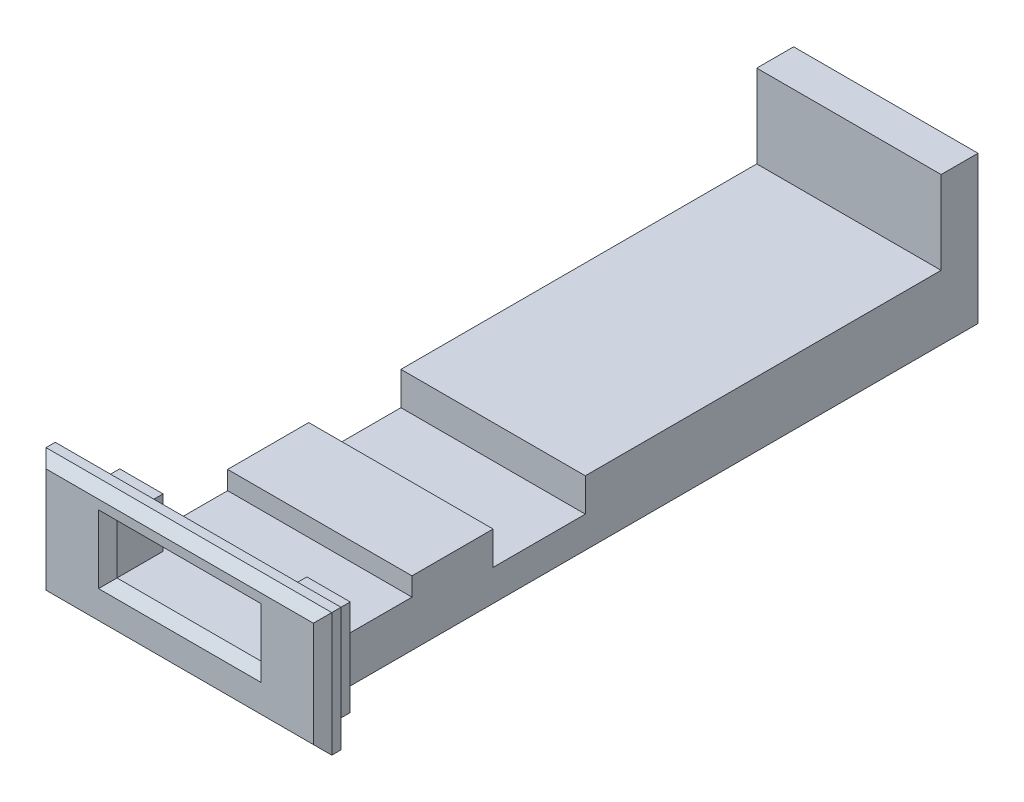
ISO-10303-21;
HEADER;
FILE_DESCRIPTION(('STEP AP214'),'2;1');
FILE_NAME('part.step','',(''),(''),'','','');
FILE_SCHEMA(('AUTOMOTIVE_DESIGN { 1 0 10303 214 1 1 1 1 }'));
ENDSEC;
DATA;
#1=APPLICATION_CONTEXT('core data for automotive mechanical design processes');
#2=APPLICATION_PROTOCOL_DEFINITION('international standard','automotive_design',2000,#1);
#3=PRODUCT_CONTEXT('',#1,'mechanical');
#4=PRODUCT('Part','Part','',(#3));
#5=PRODUCT_RELATED_PRODUCT_CATEGORY('part','',(#4));
#6=PRODUCT_DEFINITION_FORMATION('','',#4);
#7=PRODUCT_DEFINITION_CONTEXT('part definition',#1,'design');
#8=PRODUCT_DEFINITION('design','',#6,#7);
#9=PRODUCT_DEFINITION_SHAPE('','',#8);
#10=(LENGTH_UNIT() NAMED_UNIT(*) SI_UNIT(.MILLI.,.METRE.));
#11=(NAMED_UNIT(*) PLANE_ANGLE_UNIT() SI_UNIT($,.RADIAN.));
#12=(NAMED_UNIT(*) SI_UNIT($,.STERADIAN.) SOLID_ANGLE_UNIT());
#13=UNCERTAINTY_MEASURE_WITH_UNIT(LENGTH_MEASURE(1.E-05),#10,'distance_accuracy_value','');
#14=(GEOMETRIC_REPRESENTATION_CONTEXT(3) GLOBAL_UNCERTAINTY_ASSIGNED_CONTEXT((#13)) GLOBAL_UNIT_ASSIGNED_CONTEXT((#10,
#11,#12)) REPRESENTATION_CONTEXT('',''));
#15=CARTESIAN_POINT('',(0.,0.,0.));
#16=DIRECTION('',(0.,0.,1.));
#17=DIRECTION('',(1.,0.,0.));
#18=AXIS2_PLACEMENT_3D('',#15,#16,#17);
#19=CARTESIAN_POINT('',(5.,3.5,-33.3));
#20=DIRECTION('',(0.,-1.,0.));
#21=DIRECTION('',(0.,0.,-1.));
#22=AXIS2_PLACEMENT_3D('',#19,#20,#21);
#23=PLANE('',#22);
#24=DIRECTION('',(0.,0.,1.));
#25=VECTOR('',#24,1.);
#26=CARTESIAN_POINT('',(5.,3.5,-33.3));
#27=LINE('',#26,#25);
#28=CARTESIAN_POINT('',(5.,3.5,-9.));
#29=VERTEX_POINT('',#28);
#30=CARTESIAN_POINT('',(5.,3.5,-4.6));
#31=VERTEX_POINT('',#30);
#32=EDGE_CURVE('E345',#29,#31,#27,.T.);
#33=ORIENTED_EDGE('',*,*,#32,.F.);
#34=DIRECTION('',(-1.,0.,0.));
#35=VECTOR('',#34,1.);
#36=CARTESIAN_POINT('',(5.,3.5,-9.));
#37=LINE('',#36,#35);
#38=CARTESIAN_POINT('',(-5.,3.5,-9.));
#39=VERTEX_POINT('',#38);
#40=EDGE_CURVE('E423',#29,#39,#37,.T.);
#41=ORIENTED_EDGE('',*,*,#40,.T.);
#42=DIRECTION('',(0.,0.,1.));
#43=VECTOR('',#42,1.);
#44=CARTESIAN_POINT('',(-5.,3.5,-33.3));
#45=LINE('',#44,#43);
#46=CARTESIAN_POINT('',(-5.,3.5,-4.6));
#47=VERTEX_POINT('',#46);
#48=EDGE_CURVE('E357',#39,#47,#45,.T.);
#49=ORIENTED_EDGE('',*,*,#48,.T.);
#50=DIRECTION('',(1.,0.,0.));
#51=VECTOR('',#50,1.);
#52=CARTESIAN_POINT('',(5.,3.5,-4.6));
#53=LINE('',#52,#51);
#54=EDGE_CURVE('E346',#47,#31,#53,.T.);
#55=ORIENTED_EDGE('',*,*,#54,.T.);
#56=EDGE_LOOP('',(#33,#41,#49,#55));
#57=FACE_BOUND('',#56,.T.);
#58=ADVANCED_FACE('F35',(#57),#23,.F.);
#59=CARTESIAN_POINT('',(0.,0.,0.));
#60=DIRECTION('',(0.,0.,-1.));
#61=DIRECTION('',(-1.,0.,0.));
#62=AXIS2_PLACEMENT_3D('',#59,#60,#61);
#63=PLANE('',#62);
#64=DIRECTION('',(0.,-1.,0.));
#65=VECTOR('',#64,1.);
#66=CARTESIAN_POINT('',(5.,0.,0.));
#67=LINE('',#66,#65);
#68=CARTESIAN_POINT('',(5.,2.5,0.));
#69=VERTEX_POINT('',#68);
#70=CARTESIAN_POINT('',(5.,0.,0.));
#71=VERTEX_POINT('',#70);
#72=EDGE_CURVE('E361',#69,#71,#67,.T.);
#73=ORIENTED_EDGE('',*,*,#72,.F.);
#74=DIRECTION('',(1.,0.,0.));
#75=VECTOR('',#74,1.);
#76=CARTESIAN_POINT('',(5.,2.5,0.));
#77=LINE('',#76,#75);
#78=CARTESIAN_POINT('',(3.9,2.5,0.));
#79=VERTEX_POINT('',#78);
#80=EDGE_CURVE('E374',#79,#69,#77,.T.);
#81=ORIENTED_EDGE('',*,*,#80,.F.);
#82=DIRECTION('',(0.,1.,0.));
#83=VECTOR('',#82,1.);
#84=CARTESIAN_POINT('',(3.9,2.5,0.));
#85=LINE('',#84,#83);
#86=CARTESIAN_POINT('',(3.9,5.2,0.));
#87=VERTEX_POINT('',#86);
#88=EDGE_CURVE('E390',#79,#87,#85,.T.);
#89=ORIENTED_EDGE('',*,*,#88,.T.);
#90=DIRECTION('',(-1.,0.,0.));
#91=VECTOR('',#90,1.);
#92=CARTESIAN_POINT('',(-6.25,5.2,0.));
#93=LINE('',#92,#91);
#94=CARTESIAN_POINT('',(6.25,5.2,0.));
#95=VERTEX_POINT('',#94);
#96=EDGE_CURVE('E251',#95,#87,#93,.T.);
#97=ORIENTED_EDGE('',*,*,#96,.F.);
#98=DIRECTION('',(0.,1.,0.));
#99=VECTOR('',#98,1.);
#100=CARTESIAN_POINT('',(6.25,0.,0.));
#101=LINE('',#100,#99);
#102=CARTESIAN_POINT('',(6.25,0.,0.));
#103=VERTEX_POINT('',#102);
#104=EDGE_CURVE('E406',#103,#95,#101,.T.);
#105=ORIENTED_EDGE('',*,*,#104,.F.);
#106=DIRECTION('',(1.,0.,0.));
#107=VECTOR('',#106,1.);
#108=CARTESIAN_POINT('',(-6.25,0.,0.));
#109=LINE('',#108,#107);
#110=EDGE_CURVE('E402',#71,#103,#109,.T.);
#111=ORIENTED_EDGE('',*,*,#110,.F.);
#112=EDGE_LOOP('',(#73,#81,#89,#97,#105,#111));
#113=FACE_BOUND('',#112,.T.);
#114=ADVANCED_FACE('F513',(#113),#63,.T.);
#115=CARTESIAN_POINT('',(-6.25,5.2,2.));
#116=DIRECTION('',(0.,-1.,0.));
#117=DIRECTION('',(0.,0.,-1.));
#118=AXIS2_PLACEMENT_3D('',#115,#116,#117);
#119=PLANE('',#118);
#120=DIRECTION('',(-1.,0.,0.));
#121=VECTOR('',#120,1.);
#122=CARTESIAN_POINT('',(-6.25,5.2,2.));
#123=LINE('',#122,#121);
#124=CARTESIAN_POINT('',(-3.9,5.2,2.));
#125=VERTEX_POINT('',#124);
#126=CARTESIAN_POINT('',(-6.25,5.2,2.));
#127=VERTEX_POINT('',#126);
#128=EDGE_CURVE('E264',#125,#127,#123,.T.);
#129=ORIENTED_EDGE('',*,*,#128,.F.);
#130=DIRECTION('',(0.,0.,1.));
#131=VECTOR('',#130,1.);
#132=CARTESIAN_POINT('',(-3.9,5.2,0.));
#133=LINE('',#132,#131);
#134=CARTESIAN_POINT('',(-3.9,5.2,0.));
#135=VERTEX_POINT('',#134);
#136=EDGE_CURVE('E253',#135,#125,#133,.T.);
#137=ORIENTED_EDGE('',*,*,#136,.F.);
#138=CARTESIAN_POINT('',(-6.25,5.2,0.));
#139=VERTEX_POINT('',#138);
#140=EDGE_CURVE('E408',#135,#139,#93,.T.);
#141=ORIENTED_EDGE('',*,*,#140,.T.);
#142=DIRECTION('',(0.,0.,-1.));
#143=VECTOR('',#142,1.);
#144=CARTESIAN_POINT('',(-6.25,5.2,2.));
#145=LINE('',#144,#143);
#146=EDGE_CURVE('E263',#127,#139,#145,.T.);
#147=ORIENTED_EDGE('',*,*,#146,.F.);
#148=EDGE_LOOP('',(#129,#137,#141,#147));
#149=FACE_BOUND('',#148,.T.);
#150=ADVANCED_FACE('F520',(#149),#119,.F.);
#151=CARTESIAN_POINT('',(-6.25,0.,2.));
#152=DIRECTION('',(1.,0.,0.));
#153=DIRECTION('',(0.,0.,-1.));
#154=AXIS2_PLACEMENT_3D('',#151,#152,#153);
#155=PLANE('',#154);
#156=DIRECTION('',(0.,-1.,0.));
#157=VECTOR('',#156,1.);
#158=CARTESIAN_POINT('',(-6.25,0.,0.));
#159=LINE('',#158,#157);
#160=CARTESIAN_POINT('',(-6.25,0.,0.));
#161=VERTEX_POINT('',#160);
#162=EDGE_CURVE('E394',#139,#161,#159,.T.);
#163=ORIENTED_EDGE('',*,*,#162,.T.);
#164=DIRECTION('',(0.,0.,-1.));
#165=VECTOR('',#164,1.);
#166=CARTESIAN_POINT('',(-6.25,0.,2.));
#167=LINE('',#166,#165);
#168=CARTESIAN_POINT('',(-6.25,0.,2.));
#169=VERTEX_POINT('',#168);
#170=EDGE_CURVE('E417',#169,#161,#167,.T.);
#171=ORIENTED_EDGE('',*,*,#170,.F.);
#172=DIRECTION('',(0.,-1.,0.));
#173=VECTOR('',#172,1.);
#174=CARTESIAN_POINT('',(-6.25,0.,2.));
#175=LINE('',#174,#173);
#176=EDGE_CURVE('E396',#127,#169,#175,.T.);
#177=ORIENTED_EDGE('',*,*,#176,.F.);
#178=ORIENTED_EDGE('',*,*,#146,.T.);
#179=EDGE_LOOP('',(#163,#171,#177,#178));
#180=FACE_BOUND('',#179,.T.);
#181=ADVANCED_FACE('F620',(#180),#155,.F.);
#182=CARTESIAN_POINT('',(-6.25,0.,2.));
#183=DIRECTION('',(0.,1.,0.));
#184=DIRECTION('',(0.,0.,1.));
#185=AXIS2_PLACEMENT_3D('',#182,#183,#184);
#186=PLANE('',#185);
#187=DIRECTION('',(0.,0.,-1.));
#188=VECTOR('',#187,1.);
#189=CARTESIAN_POINT('',(7.75,0.,3.));
#190=LINE('',#189,#188);
#191=CARTESIAN_POINT('',(7.75,0.,2.5));
#192=VERTEX_POINT('',#191);
#193=CARTESIAN_POINT('',(7.75,0.,2.));
#194=VERTEX_POINT('',#193);
#195=EDGE_CURVE('E292',#192,#194,#190,.T.);
#196=ORIENTED_EDGE('',*,*,#195,.F.);
#197=DIRECTION('',(-1.,0.,0.));
#198=VECTOR('',#197,1.);
#199=CARTESIAN_POINT('',(-6.25,0.,2.5));
#200=LINE('',#199,#198);
#201=CARTESIAN_POINT('',(-7.75,0.,2.5));
#202=VERTEX_POINT('',#201);
#203=EDGE_CURVE('E45',#192,#202,#200,.T.);
#204=ORIENTED_EDGE('',*,*,#203,.T.);
#205=DIRECTION('',(0.,0.,-1.));
#206=VECTOR('',#205,1.);
#207=CARTESIAN_POINT('',(-7.75,0.,3.));
#208=LINE('',#207,#206);
#209=CARTESIAN_POINT('',(-7.75,0.,2.));
#210=VERTEX_POINT('',#209);
#211=EDGE_CURVE('E294',#202,#210,#208,.T.);
#212=ORIENTED_EDGE('',*,*,#211,.T.);
#213=DIRECTION('',(1.,0.,0.));
#214=VECTOR('',#213,1.);
#215=CARTESIAN_POINT('',(-7.75,0.,2.));
#216=LINE('',#215,#214);
#217=EDGE_CURVE('E279',#210,#169,#216,.T.);
#218=ORIENTED_EDGE('',*,*,#217,.T.);
#219=ORIENTED_EDGE('',*,*,#170,.T.);
#220=CARTESIAN_POINT('',(-5.,0.,0.));
#221=VERTEX_POINT('',#220);
#222=EDGE_CURVE('E403',#161,#221,#109,.T.);
#223=ORIENTED_EDGE('',*,*,#222,.T.);
#224=DIRECTION('',(0.,0.,1.));
#225=VECTOR('',#224,1.);
#226=CARTESIAN_POINT('',(-5.,0.,-4.6));
#227=LINE('',#226,#225);
#228=CARTESIAN_POINT('',(-5.,0.,-35.3));
#229=VERTEX_POINT('',#228);
#230=EDGE_CURVE('E380',#229,#221,#227,.T.);
#231=ORIENTED_EDGE('',*,*,#230,.F.);
#232=DIRECTION('',(-1.,0.,0.));
#233=VECTOR('',#232,1.);
#234=CARTESIAN_POINT('',(-5.,0.,-35.3));
#235=LINE('',#234,#233);
#236=CARTESIAN_POINT('',(5.,0.,-35.3));
#237=VERTEX_POINT('',#236);
#238=EDGE_CURVE('E327',#237,#229,#235,.T.);
#239=ORIENTED_EDGE('',*,*,#238,.F.);
#240=DIRECTION('',(0.,0.,1.));
#241=VECTOR('',#240,1.);
#242=CARTESIAN_POINT('',(5.,0.,-4.6));
#243=LINE('',#242,#241);
#244=EDGE_CURVE('E383',#237,#71,#243,.T.);
#245=ORIENTED_EDGE('',*,*,#244,.T.);
#246=ORIENTED_EDGE('',*,*,#110,.T.);
#247=DIRECTION('',(0.,0.,-1.));
#248=VECTOR('',#247,1.);
#249=CARTESIAN_POINT('',(6.25,0.,2.));
#250=LINE('',#249,#248);
#251=CARTESIAN_POINT('',(6.25,0.,2.));
#252=VERTEX_POINT('',#251);
#253=EDGE_CURVE('E414',#252,#103,#250,.T.);
#254=ORIENTED_EDGE('',*,*,#253,.F.);
#255=EDGE_CURVE('E278',#252,#194,#216,.T.);
#256=ORIENTED_EDGE('',*,*,#255,.T.);
#257=EDGE_LOOP('',(#196,#204,#212,#218,#219,#223,#231,#239,#245,#246,#254,#256));
#258=FACE_BOUND('',#257,.T.);
#259=ADVANCED_FACE('F559',(#258),#186,.F.);
#260=CARTESIAN_POINT('',(6.25,0.,2.));
#261=DIRECTION('',(-1.,0.,0.));
#262=DIRECTION('',(0.,0.,1.));
#263=AXIS2_PLACEMENT_3D('',#260,#261,#262);
#264=PLANE('',#263);
#265=ORIENTED_EDGE('',*,*,#104,.T.);
#266=DIRECTION('',(0.,0.,-1.));
#267=VECTOR('',#266,1.);
#268=CARTESIAN_POINT('',(6.25,5.2,2.));
#269=LINE('',#268,#267);
#270=CARTESIAN_POINT('',(6.25,5.2,2.));
#271=VERTEX_POINT('',#270);
#272=EDGE_CURVE('E412',#271,#95,#269,.T.);
#273=ORIENTED_EDGE('',*,*,#272,.F.);
#274=DIRECTION('',(0.,1.,0.));
#275=VECTOR('',#274,1.);
#276=CARTESIAN_POINT('',(6.25,0.,2.));
#277=LINE('',#276,#275);
#278=EDGE_CURVE('E262',#252,#271,#277,.T.);
#279=ORIENTED_EDGE('',*,*,#278,.F.);
#280=ORIENTED_EDGE('',*,*,#253,.T.);
#281=EDGE_LOOP('',(#265,#273,#279,#280));
#282=FACE_BOUND('',#281,.T.);
#283=ADVANCED_FACE('F633',(#282),#264,.F.);
#284=ORIENTED_EDGE('',*,*,#96,.T.);
#285=DIRECTION('',(0.,0.,-1.));
#286=VECTOR('',#285,1.);
#287=CARTESIAN_POINT('',(3.9,5.2,0.));
#288=LINE('',#287,#286);
#289=CARTESIAN_POINT('',(3.9,5.2,2.));
#290=VERTEX_POINT('',#289);
#291=EDGE_CURVE('E232',#290,#87,#288,.T.);
#292=ORIENTED_EDGE('',*,*,#291,.F.);
#293=EDGE_CURVE('E248',#271,#290,#123,.T.);
#294=ORIENTED_EDGE('',*,*,#293,.F.);
#295=ORIENTED_EDGE('',*,*,#272,.T.);
#296=EDGE_LOOP('',(#284,#292,#294,#295));
#297=FACE_BOUND('',#296,.T.);
#298=ADVANCED_FACE('F246',(#297),#119,.F.);
#299=CARTESIAN_POINT('',(-5.,2.5,0.));
#300=VERTEX_POINT('',#299);
#301=CARTESIAN_POINT('',(-3.9,2.5,0.));
#302=VERTEX_POINT('',#301);
#303=EDGE_CURVE('E366',#300,#302,#77,.T.);
#304=ORIENTED_EDGE('',*,*,#303,.F.);
#305=DIRECTION('',(0.,1.,0.));
#306=VECTOR('',#305,1.);
#307=CARTESIAN_POINT('',(-5.,0.,0.));
#308=LINE('',#307,#306);
#309=EDGE_CURVE('E369',#221,#300,#308,.T.);
#310=ORIENTED_EDGE('',*,*,#309,.F.);
#311=ORIENTED_EDGE('',*,*,#222,.F.);
#312=ORIENTED_EDGE('',*,*,#162,.F.);
#313=ORIENTED_EDGE('',*,*,#140,.F.);
#314=DIRECTION('',(0.,1.,0.));
#315=VECTOR('',#314,1.);
#316=CARTESIAN_POINT('',(-3.9,2.5,0.));
#317=LINE('',#316,#315);
#318=EDGE_CURVE('E392',#302,#135,#317,.T.);
#319=ORIENTED_EDGE('',*,*,#318,.F.);
#320=EDGE_LOOP('',(#304,#310,#311,#312,#313,#319));
#321=FACE_BOUND('',#320,.T.);
#322=ADVANCED_FACE('F523',(#321),#63,.T.);
#323=CARTESIAN_POINT('',(-3.9,2.5,0.));
#324=DIRECTION('',(-1.,0.,0.));
#325=DIRECTION('',(0.,0.,1.));
#326=AXIS2_PLACEMENT_3D('',#323,#324,#325);
#327=PLANE('',#326);
#328=DIRECTION('',(0.,0.,-1.));
#329=VECTOR('',#328,1.);
#330=CARTESIAN_POINT('',(-3.9,5.2,3.));
#331=LINE('',#330,#329);
#332=CARTESIAN_POINT('',(-3.9,5.2,2.5));
#333=VERTEX_POINT('',#332);
#334=EDGE_CURVE('E240',#333,#125,#331,.T.);
#335=ORIENTED_EDGE('',*,*,#334,.F.);
#336=DIRECTION('',(0.,-1.,0.));
#337=VECTOR('',#336,1.);
#338=CARTESIAN_POINT('',(-3.9,2.5,2.5));
#339=LINE('',#338,#337);
#340=CARTESIAN_POINT('',(-3.9,2.5,2.5));
#341=VERTEX_POINT('',#340);
#342=EDGE_CURVE('E453',#333,#341,#339,.T.);
#343=ORIENTED_EDGE('',*,*,#342,.T.);
#344=DIRECTION('',(0.,0.,1.));
#345=VECTOR('',#344,1.);
#346=CARTESIAN_POINT('',(-3.9,2.5,0.));
#347=LINE('',#346,#345);
#348=EDGE_CURVE('E252',#302,#341,#347,.T.);
#349=ORIENTED_EDGE('',*,*,#348,.F.);
#350=ORIENTED_EDGE('',*,*,#318,.T.);
#351=ORIENTED_EDGE('',*,*,#136,.T.);
#352=EDGE_LOOP('',(#335,#343,#349,#350,#351));
#353=FACE_BOUND('',#352,.T.);
#354=ADVANCED_FACE('F664',(#353),#327,.F.);
#355=CARTESIAN_POINT('',(3.9,2.5,0.));
#356=DIRECTION('',(1.,0.,0.));
#357=DIRECTION('',(0.,0.,-1.));
#358=AXIS2_PLACEMENT_3D('',#355,#356,#357);
#359=PLANE('',#358);
#360=DIRECTION('',(0.,0.,-1.));
#361=VECTOR('',#360,1.);
#362=CARTESIAN_POINT('',(3.9,2.5,0.));
#363=LINE('',#362,#361);
#364=CARTESIAN_POINT('',(3.9,2.5,2.5));
#365=VERTEX_POINT('',#364);
#366=EDGE_CURVE('E388',#365,#79,#363,.T.);
#367=ORIENTED_EDGE('',*,*,#366,.F.);
#368=DIRECTION('',(0.,1.,0.));
#369=VECTOR('',#368,1.);
#370=CARTESIAN_POINT('',(3.9,2.5,2.5));
#371=LINE('',#370,#369);
#372=CARTESIAN_POINT('',(3.9,5.2,2.5));
#373=VERTEX_POINT('',#372);
#374=EDGE_CURVE('E235',#365,#373,#371,.T.);
#375=ORIENTED_EDGE('',*,*,#374,.T.);
#376=DIRECTION('',(0.,0.,-1.));
#377=VECTOR('',#376,1.);
#378=CARTESIAN_POINT('',(3.9,5.2,3.));
#379=LINE('',#378,#377);
#380=EDGE_CURVE('E227',#373,#290,#379,.T.);
#381=ORIENTED_EDGE('',*,*,#380,.T.);
#382=ORIENTED_EDGE('',*,*,#291,.T.);
#383=ORIENTED_EDGE('',*,*,#88,.F.);
#384=EDGE_LOOP('',(#367,#375,#381,#382,#383));
#385=FACE_BOUND('',#384,.T.);
#386=ADVANCED_FACE('F230',(#385),#359,.F.);
#387=CARTESIAN_POINT('',(0.,2.5,0.));
#388=DIRECTION('',(0.,1.,0.));
#389=DIRECTION('',(0.,0.,1.));
#390=AXIS2_PLACEMENT_3D('',#387,#388,#389);
#391=PLANE('',#390);
#392=ORIENTED_EDGE('',*,*,#348,.T.);
#393=DIRECTION('',(1.,0.,0.));
#394=VECTOR('',#393,1.);
#395=CARTESIAN_POINT('',(3.9,2.5,2.5));
#396=LINE('',#395,#394);
#397=EDGE_CURVE('E429',#341,#365,#396,.T.);
#398=ORIENTED_EDGE('',*,*,#397,.T.);
#399=ORIENTED_EDGE('',*,*,#366,.T.);
#400=ORIENTED_EDGE('',*,*,#80,.T.);
#401=DIRECTION('',(0.,0.,1.));
#402=VECTOR('',#401,1.);
#403=CARTESIAN_POINT('',(5.,2.5,-4.6));
#404=LINE('',#403,#402);
#405=CARTESIAN_POINT('',(5.,2.5,-4.6));
#406=VERTEX_POINT('',#405);
#407=EDGE_CURVE('E365',#406,#69,#404,.T.);
#408=ORIENTED_EDGE('',*,*,#407,.F.);
#409=DIRECTION('',(1.,0.,0.));
#410=VECTOR('',#409,1.);
#411=CARTESIAN_POINT('',(5.,2.5,-4.6));
#412=LINE('',#411,#410);
#413=CARTESIAN_POINT('',(-5.,2.5,-4.6));
#414=VERTEX_POINT('',#413);
#415=EDGE_CURVE('E362',#414,#406,#412,.T.);
#416=ORIENTED_EDGE('',*,*,#415,.F.);
#417=DIRECTION('',(0.,0.,1.));
#418=VECTOR('',#417,1.);
#419=CARTESIAN_POINT('',(-5.,2.5,-4.6));
#420=LINE('',#419,#418);
#421=EDGE_CURVE('E377',#414,#300,#420,.T.);
#422=ORIENTED_EDGE('',*,*,#421,.T.);
#423=ORIENTED_EDGE('',*,*,#303,.T.);
#424=EDGE_LOOP('',(#392,#398,#399,#400,#408,#416,#422,#423));
#425=FACE_BOUND('',#424,.T.);
#426=ADVANCED_FACE('F566',(#425),#391,.T.);
#427=CARTESIAN_POINT('',(5.,0.,-4.6));
#428=DIRECTION('',(-1.,0.,0.));
#429=DIRECTION('',(0.,0.,1.));
#430=AXIS2_PLACEMENT_3D('',#427,#428,#429);
#431=PLANE('',#430);
#432=DIRECTION('',(0.,0.,1.));
#433=VECTOR('',#432,1.);
#434=CARTESIAN_POINT('',(5.,1.69855255759942,-4.6));
#435=LINE('',#434,#433);
#436=CARTESIAN_POINT('',(5.,1.69855255759942,-14.));
#437=VERTEX_POINT('',#436);
#438=CARTESIAN_POINT('',(5.,1.69855255759942,-9.));
#439=VERTEX_POINT('',#438);
#440=EDGE_CURVE('E314',#437,#439,#435,.T.);
#441=ORIENTED_EDGE('',*,*,#440,.T.);
#442=DIRECTION('',(0.,1.,0.));
#443=VECTOR('',#442,1.);
#444=CARTESIAN_POINT('',(5.,0.,-9.));
#445=LINE('',#444,#443);
#446=EDGE_CURVE('E311',#439,#29,#445,.T.);
#447=ORIENTED_EDGE('',*,*,#446,.T.);
#448=ORIENTED_EDGE('',*,*,#32,.T.);
#449=DIRECTION('',(0.,-1.,0.));
#450=VECTOR('',#449,1.);
#451=CARTESIAN_POINT('',(5.,0.,-4.6));
#452=LINE('',#451,#450);
#453=EDGE_CURVE('E341',#31,#406,#452,.T.);
#454=ORIENTED_EDGE('',*,*,#453,.T.);
#455=ORIENTED_EDGE('',*,*,#407,.T.);
#456=ORIENTED_EDGE('',*,*,#72,.T.);
#457=ORIENTED_EDGE('',*,*,#244,.F.);
#458=DIRECTION('',(0.,-1.,0.));
#459=VECTOR('',#458,1.);
#460=CARTESIAN_POINT('',(5.,0.,-35.3));
#461=LINE('',#460,#459);
#462=CARTESIAN_POINT('',(5.,8.,-35.3));
#463=VERTEX_POINT('',#462);
#464=EDGE_CURVE('E324',#463,#237,#461,.T.);
#465=ORIENTED_EDGE('',*,*,#464,.F.);
#466=DIRECTION('',(0.,0.,1.));
#467=VECTOR('',#466,1.);
#468=CARTESIAN_POINT('',(5.,8.,-35.3));
#469=LINE('',#468,#467);
#470=CARTESIAN_POINT('',(5.,8.,-33.3));
#471=VERTEX_POINT('',#470);
#472=EDGE_CURVE('E330',#463,#471,#469,.T.);
#473=ORIENTED_EDGE('',*,*,#472,.T.);
#474=DIRECTION('',(0.,-1.,0.));
#475=VECTOR('',#474,1.);
#476=CARTESIAN_POINT('',(5.,0.,-33.3));
#477=LINE('',#476,#475);
#478=CARTESIAN_POINT('',(5.,3.5,-33.3));
#479=VERTEX_POINT('',#478);
#480=EDGE_CURVE('E322',#471,#479,#477,.T.);
#481=ORIENTED_EDGE('',*,*,#480,.T.);
#482=CARTESIAN_POINT('',(5.,3.5,-14.));
#483=VERTEX_POINT('',#482);
#484=EDGE_CURVE('E354',#479,#483,#27,.T.);
#485=ORIENTED_EDGE('',*,*,#484,.T.);
#486=DIRECTION('',(0.,-1.,0.));
#487=VECTOR('',#486,1.);
#488=CARTESIAN_POINT('',(5.,0.,-14.));
#489=LINE('',#488,#487);
#490=EDGE_CURVE('E305',#483,#437,#489,.T.);
#491=ORIENTED_EDGE('',*,*,#490,.T.);
#492=EDGE_LOOP('',(#441,#447,#448,#454,#455,#456,#457,#465,#473,#481,#485,#491));
#493=FACE_BOUND('',#492,.T.);
#494=ADVANCED_FACE('F537',(#493),#431,.F.);
#495=CARTESIAN_POINT('',(-5.,0.,-4.6));
#496=DIRECTION('',(1.,0.,0.));
#497=DIRECTION('',(0.,0.,-1.));
#498=AXIS2_PLACEMENT_3D('',#495,#496,#497);
#499=PLANE('',#498);
#500=ORIENTED_EDGE('',*,*,#48,.F.);
#501=DIRECTION('',(0.,-1.,0.));
#502=VECTOR('',#501,1.);
#503=CARTESIAN_POINT('',(-5.,0.,-9.));
#504=LINE('',#503,#502);
#505=CARTESIAN_POINT('',(-5.,1.69855255759942,-9.));
#506=VERTEX_POINT('',#505);
#507=EDGE_CURVE('E308',#39,#506,#504,.T.);
#508=ORIENTED_EDGE('',*,*,#507,.T.);
#509=DIRECTION('',(0.,0.,-1.));
#510=VECTOR('',#509,1.);
#511=CARTESIAN_POINT('',(-5.,1.69855255759942,-4.6));
#512=LINE('',#511,#510);
#513=CARTESIAN_POINT('',(-5.,1.69855255759942,-14.));
#514=VERTEX_POINT('',#513);
#515=EDGE_CURVE('E426',#506,#514,#512,.T.);
#516=ORIENTED_EDGE('',*,*,#515,.T.);
#517=DIRECTION('',(0.,1.,0.));
#518=VECTOR('',#517,1.);
#519=CARTESIAN_POINT('',(-5.,0.,-14.));
#520=LINE('',#519,#518);
#521=CARTESIAN_POINT('',(-5.,3.5,-14.));
#522=VERTEX_POINT('',#521);
#523=EDGE_CURVE('E300',#514,#522,#520,.T.);
#524=ORIENTED_EDGE('',*,*,#523,.T.);
#525=CARTESIAN_POINT('',(-5.,3.5,-33.3));
#526=VERTEX_POINT('',#525);
#527=EDGE_CURVE('E358',#526,#522,#45,.T.);
#528=ORIENTED_EDGE('',*,*,#527,.F.);
#529=DIRECTION('',(0.,1.,0.));
#530=VECTOR('',#529,1.);
#531=CARTESIAN_POINT('',(-5.,0.,-33.3));
#532=LINE('',#531,#530);
#533=CARTESIAN_POINT('',(-5.,8.,-33.3));
#534=VERTEX_POINT('',#533);
#535=EDGE_CURVE('E317',#526,#534,#532,.T.);
#536=ORIENTED_EDGE('',*,*,#535,.T.);
#537=DIRECTION('',(0.,0.,1.));
#538=VECTOR('',#537,1.);
#539=CARTESIAN_POINT('',(-5.,8.,-35.3));
#540=LINE('',#539,#538);
#541=CARTESIAN_POINT('',(-5.,8.,-35.3));
#542=VERTEX_POINT('',#541);
#543=EDGE_CURVE('E338',#542,#534,#540,.T.);
#544=ORIENTED_EDGE('',*,*,#543,.F.);
#545=DIRECTION('',(0.,1.,0.));
#546=VECTOR('',#545,1.);
#547=CARTESIAN_POINT('',(-5.,0.,-35.3));
#548=LINE('',#547,#546);
#549=EDGE_CURVE('E318',#229,#542,#548,.T.);
#550=ORIENTED_EDGE('',*,*,#549,.F.);
#551=ORIENTED_EDGE('',*,*,#230,.T.);
#552=ORIENTED_EDGE('',*,*,#309,.T.);
#553=ORIENTED_EDGE('',*,*,#421,.F.);
#554=DIRECTION('',(0.,1.,0.));
#555=VECTOR('',#554,1.);
#556=CARTESIAN_POINT('',(-5.,0.,-4.6));
#557=LINE('',#556,#555);
#558=EDGE_CURVE('E349',#414,#47,#557,.T.);
#559=ORIENTED_EDGE('',*,*,#558,.T.);
#560=EDGE_LOOP('',(#500,#508,#516,#524,#528,#536,#544,#550,#551,#552,#553,#559));
#561=FACE_BOUND('',#560,.T.);
#562=ADVANCED_FACE('F529',(#561),#499,.F.);
#563=ORIENTED_EDGE('',*,*,#527,.T.);
#564=DIRECTION('',(1.,0.,0.));
#565=VECTOR('',#564,1.);
#566=CARTESIAN_POINT('',(5.,3.5,-14.));
#567=LINE('',#566,#565);
#568=EDGE_CURVE('E420',#522,#483,#567,.T.);
#569=ORIENTED_EDGE('',*,*,#568,.T.);
#570=ORIENTED_EDGE('',*,*,#484,.F.);
#571=DIRECTION('',(1.,0.,0.));
#572=VECTOR('',#571,1.);
#573=CARTESIAN_POINT('',(5.,3.5,-33.3));
#574=LINE('',#573,#572);
#575=EDGE_CURVE('E342',#526,#479,#574,.T.);
#576=ORIENTED_EDGE('',*,*,#575,.F.);
#577=EDGE_LOOP('',(#563,#569,#570,#576));
#578=FACE_BOUND('',#577,.T.);
#579=ADVANCED_FACE('F516',(#578),#23,.F.);
#580=CARTESIAN_POINT('',(0.,0.,-4.6));
#581=DIRECTION('',(0.,0.,1.));
#582=DIRECTION('',(1.,0.,0.));
#583=AXIS2_PLACEMENT_3D('',#580,#581,#582);
#584=PLANE('',#583);
#585=ORIENTED_EDGE('',*,*,#558,.F.);
#586=ORIENTED_EDGE('',*,*,#415,.T.);
#587=ORIENTED_EDGE('',*,*,#453,.F.);
#588=ORIENTED_EDGE('',*,*,#54,.F.);
#589=EDGE_LOOP('',(#585,#586,#587,#588));
#590=FACE_BOUND('',#589,.T.);
#591=ADVANCED_FACE('F528',(#590),#584,.T.);
#592=CARTESIAN_POINT('',(0.,0.,-33.3));
#593=DIRECTION('',(0.,0.,-1.));
#594=DIRECTION('',(-1.,0.,0.));
#595=AXIS2_PLACEMENT_3D('',#592,#593,#594);
#596=PLANE('',#595);
#597=ORIENTED_EDGE('',*,*,#535,.F.);
#598=ORIENTED_EDGE('',*,*,#575,.T.);
#599=ORIENTED_EDGE('',*,*,#480,.F.);
#600=DIRECTION('',(1.,0.,0.));
#601=VECTOR('',#600,1.);
#602=CARTESIAN_POINT('',(-5.,8.,-33.3));
#603=LINE('',#602,#601);
#604=EDGE_CURVE('E332',#534,#471,#603,.T.);
#605=ORIENTED_EDGE('',*,*,#604,.F.);
#606=EDGE_LOOP('',(#597,#598,#599,#605));
#607=FACE_BOUND('',#606,.T.);
#608=ADVANCED_FACE('F535',(#607),#596,.F.);
#609=CARTESIAN_POINT('',(-5.,8.,-35.3));
#610=DIRECTION('',(0.,-1.,0.));
#611=DIRECTION('',(0.,0.,-1.));
#612=AXIS2_PLACEMENT_3D('',#609,#610,#611);
#613=PLANE('',#612);
#614=ORIENTED_EDGE('',*,*,#604,.T.);
#615=ORIENTED_EDGE('',*,*,#472,.F.);
#616=DIRECTION('',(1.,0.,0.));
#617=VECTOR('',#616,1.);
#618=CARTESIAN_POINT('',(-5.,8.,-35.3));
#619=LINE('',#618,#617);
#620=EDGE_CURVE('E321',#542,#463,#619,.T.);
#621=ORIENTED_EDGE('',*,*,#620,.F.);
#622=ORIENTED_EDGE('',*,*,#543,.T.);
#623=EDGE_LOOP('',(#614,#615,#621,#622));
#624=FACE_BOUND('',#623,.T.);
#625=ADVANCED_FACE('F553',(#624),#613,.F.);
#626=CARTESIAN_POINT('',(0.,0.,-35.3));
#627=DIRECTION('',(0.,0.,-1.));
#628=DIRECTION('',(-1.,0.,0.));
#629=AXIS2_PLACEMENT_3D('',#626,#627,#628);
#630=PLANE('',#629);
#631=ORIENTED_EDGE('',*,*,#549,.T.);
#632=ORIENTED_EDGE('',*,*,#620,.T.);
#633=ORIENTED_EDGE('',*,*,#464,.T.);
#634=ORIENTED_EDGE('',*,*,#238,.T.);
#635=EDGE_LOOP('',(#631,#632,#633,#634));
#636=FACE_BOUND('',#635,.T.);
#637=ADVANCED_FACE('F556',(#636),#630,.T.);
#638=CARTESIAN_POINT('',(-6.25,1.69855255759942,-9.));
#639=DIRECTION('',(0.,-1.,0.));
#640=DIRECTION('',(0.,0.,-1.));
#641=AXIS2_PLACEMENT_3D('',#638,#639,#640);
#642=PLANE('',#641);
#643=DIRECTION('',(1.,0.,0.));
#644=VECTOR('',#643,1.);
#645=CARTESIAN_POINT('',(-6.25,1.69855255759942,-14.));
#646=LINE('',#645,#644);
#647=EDGE_CURVE('E297',#514,#437,#646,.T.);
#648=ORIENTED_EDGE('',*,*,#647,.F.);
#649=ORIENTED_EDGE('',*,*,#515,.F.);
#650=DIRECTION('',(1.,0.,0.));
#651=VECTOR('',#650,1.);
#652=CARTESIAN_POINT('',(-6.25,1.69855255759942,-9.));
#653=LINE('',#652,#651);
#654=EDGE_CURVE('E296',#506,#439,#653,.T.);
#655=ORIENTED_EDGE('',*,*,#654,.T.);
#656=ORIENTED_EDGE('',*,*,#440,.F.);
#657=EDGE_LOOP('',(#648,#649,#655,#656));
#658=FACE_BOUND('',#657,.T.);
#659=ADVANCED_FACE('F546',(#658),#642,.F.);
#660=CARTESIAN_POINT('',(-6.25,1.69855255759942,-9.));
#661=DIRECTION('',(0.,0.,1.));
#662=DIRECTION('',(1.,0.,0.));
#663=AXIS2_PLACEMENT_3D('',#660,#661,#662);
#664=PLANE('',#663);
#665=ORIENTED_EDGE('',*,*,#654,.F.);
#666=ORIENTED_EDGE('',*,*,#507,.F.);
#667=ORIENTED_EDGE('',*,*,#40,.F.);
#668=ORIENTED_EDGE('',*,*,#446,.F.);
#669=EDGE_LOOP('',(#665,#666,#667,#668));
#670=FACE_BOUND('',#669,.T.);
#671=ADVANCED_FACE('F508',(#670),#664,.F.);
#672=CARTESIAN_POINT('',(-6.25,1.69855255759942,-14.));
#673=DIRECTION('',(0.,0.,-1.));
#674=DIRECTION('',(-1.,0.,0.));
#675=AXIS2_PLACEMENT_3D('',#672,#673,#674);
#676=PLANE('',#675);
#677=ORIENTED_EDGE('',*,*,#568,.F.);
#678=ORIENTED_EDGE('',*,*,#523,.F.);
#679=ORIENTED_EDGE('',*,*,#647,.T.);
#680=ORIENTED_EDGE('',*,*,#490,.F.);
#681=EDGE_LOOP('',(#677,#678,#679,#680));
#682=FACE_BOUND('',#681,.T.);
#683=ADVANCED_FACE('F499',(#682),#676,.F.);
#684=CARTESIAN_POINT('',(0.,0.,3.));
#685=DIRECTION('',(0.,0.,-1.));
#686=DIRECTION('',(-1.,0.,0.));
#687=AXIS2_PLACEMENT_3D('',#684,#685,#686);
#688=PLANE('',#687);
#689=DIRECTION('',(0.,-1.,0.));
#690=VECTOR('',#689,1.);
#691=CARTESIAN_POINT('',(4.4,0.,3.));
#692=LINE('',#691,#690);
#693=CARTESIAN_POINT('',(4.4,5.7,3.));
#694=VERTEX_POINT('',#693);
#695=CARTESIAN_POINT('',(4.4,2.,3.));
#696=VERTEX_POINT('',#695);
#697=EDGE_CURVE('E445',#694,#696,#692,.T.);
#698=ORIENTED_EDGE('',*,*,#697,.T.);
#699=DIRECTION('',(-1.,0.,0.));
#700=VECTOR('',#699,1.);
#701=CARTESIAN_POINT('',(-3.9,2.,3.));
#702=LINE('',#701,#700);
#703=CARTESIAN_POINT('',(-4.4,2.,3.));
#704=VERTEX_POINT('',#703);
#705=EDGE_CURVE('E447',#696,#704,#702,.T.);
#706=ORIENTED_EDGE('',*,*,#705,.T.);
#707=DIRECTION('',(0.,1.,0.));
#708=VECTOR('',#707,1.);
#709=CARTESIAN_POINT('',(-4.4,0.,3.));
#710=LINE('',#709,#708);
#711=CARTESIAN_POINT('',(-4.4,5.7,3.));
#712=VERTEX_POINT('',#711);
#713=EDGE_CURVE('E441',#704,#712,#710,.T.);
#714=ORIENTED_EDGE('',*,*,#713,.T.);
#715=DIRECTION('',(1.,0.,0.));
#716=VECTOR('',#715,1.);
#717=CARTESIAN_POINT('',(3.9,5.7,3.));
#718=LINE('',#717,#716);
#719=EDGE_CURVE('E443',#712,#694,#718,.T.);
#720=ORIENTED_EDGE('',*,*,#719,.T.);
#721=EDGE_LOOP('',(#698,#706,#714,#720));
#722=FACE_BOUND('',#721,.T.);
#723=DIRECTION('',(0.,1.,0.));
#724=VECTOR('',#723,1.);
#725=CARTESIAN_POINT('',(7.25,0.,3.));
#726=LINE('',#725,#724);
#727=CARTESIAN_POINT('',(7.25,0.5,3.));
#728=VERTEX_POINT('',#727);
#729=CARTESIAN_POINT('',(7.25,6.2,3.));
#730=VERTEX_POINT('',#729);
#731=EDGE_CURVE('E436',#728,#730,#726,.T.);
#732=ORIENTED_EDGE('',*,*,#731,.T.);
#733=DIRECTION('',(-1.,0.,0.));
#734=VECTOR('',#733,1.);
#735=CARTESIAN_POINT('',(0.,6.2,3.));
#736=LINE('',#735,#734);
#737=CARTESIAN_POINT('',(-7.25,6.2,3.));
#738=VERTEX_POINT('',#737);
#739=EDGE_CURVE('E438',#730,#738,#736,.T.);
#740=ORIENTED_EDGE('',*,*,#739,.T.);
#741=DIRECTION('',(0.,-1.,0.));
#742=VECTOR('',#741,1.);
#743=CARTESIAN_POINT('',(-7.25,0.,3.));
#744=LINE('',#743,#742);
#745=CARTESIAN_POINT('',(-7.25,0.5,3.));
#746=VERTEX_POINT('',#745);
#747=EDGE_CURVE('E432',#738,#746,#744,.T.);
#748=ORIENTED_EDGE('',*,*,#747,.T.);
#749=DIRECTION('',(1.,0.,0.));
#750=VECTOR('',#749,1.);
#751=CARTESIAN_POINT('',(0.,0.5,3.));
#752=LINE('',#751,#750);
#753=EDGE_CURVE('E434',#746,#728,#752,.T.);
#754=ORIENTED_EDGE('',*,*,#753,.T.);
#755=EDGE_LOOP('',(#732,#740,#748,#754));
#756=FACE_BOUND('',#755,.T.);
#757=ADVANCED_FACE('F497',(#722,#756),#688,.F.);
#758=CARTESIAN_POINT('',(0.,0.,2.));
#759=DIRECTION('',(0.,0.,-1.));
#760=DIRECTION('',(-1.,0.,0.));
#761=AXIS2_PLACEMENT_3D('',#758,#759,#760);
#762=PLANE('',#761);
#763=DIRECTION('',(-1.,0.,0.));
#764=VECTOR('',#763,1.);
#765=CARTESIAN_POINT('',(-3.9,5.2,2.));
#766=LINE('',#765,#764);
#767=EDGE_CURVE('E259',#290,#125,#766,.T.);
#768=ORIENTED_EDGE('',*,*,#767,.T.);
#769=ORIENTED_EDGE('',*,*,#128,.T.);
#770=ORIENTED_EDGE('',*,*,#176,.T.);
#771=ORIENTED_EDGE('',*,*,#217,.F.);
#772=DIRECTION('',(0.,-1.,0.));
#773=VECTOR('',#772,1.);
#774=CARTESIAN_POINT('',(-7.75,0.,2.));
#775=LINE('',#774,#773);
#776=CARTESIAN_POINT('',(-7.75,6.7,2.));
#777=VERTEX_POINT('',#776);
#778=EDGE_CURVE('E239',#777,#210,#775,.T.);
#779=ORIENTED_EDGE('',*,*,#778,.F.);
#780=DIRECTION('',(-1.,0.,0.));
#781=VECTOR('',#780,1.);
#782=CARTESIAN_POINT('',(-7.75,6.7,2.));
#783=LINE('',#782,#781);
#784=CARTESIAN_POINT('',(7.75,6.7,2.));
#785=VERTEX_POINT('',#784);
#786=EDGE_CURVE('E285',#785,#777,#783,.T.);
#787=ORIENTED_EDGE('',*,*,#786,.F.);
#788=DIRECTION('',(0.,1.,0.));
#789=VECTOR('',#788,1.);
#790=CARTESIAN_POINT('',(7.75,0.,2.));
#791=LINE('',#790,#789);
#792=EDGE_CURVE('E282',#194,#785,#791,.T.);
#793=ORIENTED_EDGE('',*,*,#792,.F.);
#794=ORIENTED_EDGE('',*,*,#255,.F.);
#795=ORIENTED_EDGE('',*,*,#278,.T.);
#796=ORIENTED_EDGE('',*,*,#293,.T.);
#797=EDGE_LOOP('',(#768,#769,#770,#771,#779,#787,#793,#794,#795,#796));
#798=FACE_BOUND('',#797,.T.);
#799=ADVANCED_FACE('F257',(#798),#762,.T.);
#800=CARTESIAN_POINT('',(-7.75,0.,3.));
#801=DIRECTION('',(1.,0.,0.));
#802=DIRECTION('',(0.,0.,-1.));
#803=AXIS2_PLACEMENT_3D('',#800,#801,#802);
#804=PLANE('',#803);
#805=ORIENTED_EDGE('',*,*,#211,.F.);
#806=DIRECTION('',(0.,1.,0.));
#807=VECTOR('',#806,1.);
#808=CARTESIAN_POINT('',(-7.75,0.,2.5));
#809=LINE('',#808,#807);
#810=CARTESIAN_POINT('',(-7.75,6.7,2.5));
#811=VERTEX_POINT('',#810);
#812=EDGE_CURVE('E11',#202,#811,#809,.T.);
#813=ORIENTED_EDGE('',*,*,#812,.T.);
#814=DIRECTION('',(0.,0.,-1.));
#815=VECTOR('',#814,1.);
#816=CARTESIAN_POINT('',(-7.75,6.7,3.));
#817=LINE('',#816,#815);
#818=EDGE_CURVE('E288',#811,#777,#817,.T.);
#819=ORIENTED_EDGE('',*,*,#818,.T.);
#820=ORIENTED_EDGE('',*,*,#778,.T.);
#821=EDGE_LOOP('',(#805,#813,#819,#820));
#822=FACE_BOUND('',#821,.T.);
#823=ADVANCED_FACE('F487',(#822),#804,.F.);
#824=CARTESIAN_POINT('',(7.75,0.,3.));
#825=DIRECTION('',(-1.,0.,0.));
#826=DIRECTION('',(0.,0.,1.));
#827=AXIS2_PLACEMENT_3D('',#824,#825,#826);
#828=PLANE('',#827);
#829=DIRECTION('',(0.,0.,-1.));
#830=VECTOR('',#829,1.);
#831=CARTESIAN_POINT('',(7.75,6.7,3.));
#832=LINE('',#831,#830);
#833=CARTESIAN_POINT('',(7.75,6.7,2.5));
#834=VERTEX_POINT('',#833);
#835=EDGE_CURVE('E290',#834,#785,#832,.T.);
#836=ORIENTED_EDGE('',*,*,#835,.F.);
#837=DIRECTION('',(0.,-1.,0.));
#838=VECTOR('',#837,1.);
#839=CARTESIAN_POINT('',(7.75,0.,2.5));
#840=LINE('',#839,#838);
#841=EDGE_CURVE('E60',#834,#192,#840,.T.);
#842=ORIENTED_EDGE('',*,*,#841,.T.);
#843=ORIENTED_EDGE('',*,*,#195,.T.);
#844=ORIENTED_EDGE('',*,*,#792,.T.);
#845=EDGE_LOOP('',(#836,#842,#843,#844));
#846=FACE_BOUND('',#845,.T.);
#847=ADVANCED_FACE('F695',(#846),#828,.F.);
#848=CARTESIAN_POINT('',(-7.75,6.7,3.));
#849=DIRECTION('',(0.,-1.,0.));
#850=DIRECTION('',(0.,0.,-1.));
#851=AXIS2_PLACEMENT_3D('',#848,#849,#850);
#852=PLANE('',#851);
#853=ORIENTED_EDGE('',*,*,#818,.F.);
#854=DIRECTION('',(1.,0.,0.));
#855=VECTOR('',#854,1.);
#856=CARTESIAN_POINT('',(-7.75,6.7,2.5));
#857=LINE('',#856,#855);
#858=EDGE_CURVE('E455',#811,#834,#857,.T.);
#859=ORIENTED_EDGE('',*,*,#858,.T.);
#860=ORIENTED_EDGE('',*,*,#835,.T.);
#861=ORIENTED_EDGE('',*,*,#786,.T.);
#862=EDGE_LOOP('',(#853,#859,#860,#861));
#863=FACE_BOUND('',#862,.T.);
#864=ADVANCED_FACE('F490',(#863),#852,.F.);
#865=CARTESIAN_POINT('',(-3.9,5.2,3.));
#866=DIRECTION('',(0.,-1.,0.));
#867=DIRECTION('',(0.,0.,-1.));
#868=AXIS2_PLACEMENT_3D('',#865,#866,#867);
#869=PLANE('',#868);
#870=ORIENTED_EDGE('',*,*,#380,.F.);
#871=DIRECTION('',(-1.,0.,0.));
#872=VECTOR('',#871,1.);
#873=CARTESIAN_POINT('',(-3.9,5.2,2.5));
#874=LINE('',#873,#872);
#875=EDGE_CURVE('E451',#373,#333,#874,.T.);
#876=ORIENTED_EDGE('',*,*,#875,.T.);
#877=ORIENTED_EDGE('',*,*,#334,.T.);
#878=ORIENTED_EDGE('',*,*,#767,.F.);
#879=EDGE_LOOP('',(#870,#876,#877,#878));
#880=FACE_BOUND('',#879,.T.);
#881=ADVANCED_FACE('F266',(#880),#869,.T.);
#882=CARTESIAN_POINT('',(-3.9,5.2,2.5));
#883=DIRECTION('',(0.,-0.707106781186547,0.707106781186547));
#884=DIRECTION('',(1.,0.,0.));
#885=AXIS2_PLACEMENT_3D('',#882,#883,#884);
#886=PLANE('',#885);
#887=DIRECTION('',(-0.577350269189626,-0.577350269189626,-0.577350269189626));
#888=VECTOR('',#887,1.);
#889=CARTESIAN_POINT('',(3.,4.3,1.6));
#890=LINE('',#889,#888);
#891=EDGE_CURVE('E273',#694,#373,#890,.T.);
#892=ORIENTED_EDGE('',*,*,#891,.F.);
#893=ORIENTED_EDGE('',*,*,#719,.F.);
#894=DIRECTION('',(0.577350269189626,-0.577350269189626,-0.577350269189626));
#895=VECTOR('',#894,1.);
#896=CARTESIAN_POINT('',(-3.9,5.2,2.5));
#897=LINE('',#896,#895);
#898=EDGE_CURVE('E269',#333,#712,#897,.F.);
#899=ORIENTED_EDGE('',*,*,#898,.F.);
#900=ORIENTED_EDGE('',*,*,#875,.F.);
#901=EDGE_LOOP('',(#892,#893,#899,#900));
#902=FACE_BOUND('',#901,.T.);
#903=ADVANCED_FACE('F720',(#902),#886,.T.);
#904=CARTESIAN_POINT('',(-3.9,2.5,2.5));
#905=DIRECTION('',(-0.707106781186547,0.,-0.707106781186547));
#906=DIRECTION('',(0.,-1.,0.));
#907=AXIS2_PLACEMENT_3D('',#904,#905,#906);
#908=PLANE('',#907);
#909=ORIENTED_EDGE('',*,*,#898,.T.);
#910=ORIENTED_EDGE('',*,*,#713,.F.);
#911=DIRECTION('',(-0.577350269189626,-0.577350269189626,0.577350269189626));
#912=VECTOR('',#911,1.);
#913=CARTESIAN_POINT('',(-2.6,3.8,1.2));
#914=LINE('',#913,#912);
#915=EDGE_CURVE('E462',#341,#704,#914,.T.);
#916=ORIENTED_EDGE('',*,*,#915,.F.);
#917=ORIENTED_EDGE('',*,*,#342,.F.);
#918=EDGE_LOOP('',(#909,#910,#916,#917));
#919=FACE_BOUND('',#918,.T.);
#920=ADVANCED_FACE('F728',(#919),#908,.F.);
#921=CARTESIAN_POINT('',(3.9,2.5,2.5));
#922=DIRECTION('',(0.707106781186547,0.,-0.707106781186547));
#923=DIRECTION('',(0.,1.,0.));
#924=AXIS2_PLACEMENT_3D('',#921,#922,#923);
#925=PLANE('',#924);
#926=ORIENTED_EDGE('',*,*,#891,.T.);
#927=ORIENTED_EDGE('',*,*,#374,.F.);
#928=DIRECTION('',(-0.577350269189626,0.577350269189626,-0.577350269189626));
#929=VECTOR('',#928,1.);
#930=CARTESIAN_POINT('',(2.6,3.8,1.2));
#931=LINE('',#930,#929);
#932=EDGE_CURVE('E460',#696,#365,#931,.T.);
#933=ORIENTED_EDGE('',*,*,#932,.F.);
#934=ORIENTED_EDGE('',*,*,#697,.F.);
#935=EDGE_LOOP('',(#926,#927,#933,#934));
#936=FACE_BOUND('',#935,.T.);
#937=ADVANCED_FACE('F738',(#936),#925,.F.);
#938=CARTESIAN_POINT('',(0.,2.5,2.5));
#939=DIRECTION('',(0.,0.707106781186547,0.707106781186547));
#940=DIRECTION('',(-1.,0.,0.));
#941=AXIS2_PLACEMENT_3D('',#938,#939,#940);
#942=PLANE('',#941);
#943=ORIENTED_EDGE('',*,*,#915,.T.);
#944=ORIENTED_EDGE('',*,*,#705,.F.);
#945=ORIENTED_EDGE('',*,*,#932,.T.);
#946=ORIENTED_EDGE('',*,*,#397,.F.);
#947=EDGE_LOOP('',(#943,#944,#945,#946));
#948=FACE_BOUND('',#947,.T.);
#949=ADVANCED_FACE('F748',(#948),#942,.T.);
#950=CARTESIAN_POINT('',(0.,0.5,3.));
#951=DIRECTION('',(0.,0.70710678118655,-0.707106781186545));
#952=DIRECTION('',(1.,0.,0.));
#953=AXIS2_PLACEMENT_3D('',#950,#951,#952);
#954=PLANE('',#953);
#955=DIRECTION('',(0.577350269189624,0.577350269189624,0.577350269189628));
#956=VECTOR('',#955,1.);
#957=CARTESIAN_POINT('',(-7.41666666666667,0.333333333333334,2.83333333333333));
#958=LINE('',#957,#956);
#959=EDGE_CURVE('E469',#202,#746,#958,.T.);
#960=ORIENTED_EDGE('',*,*,#959,.F.);
#961=ORIENTED_EDGE('',*,*,#203,.F.);
#962=DIRECTION('',(-0.577350269189624,0.577350269189624,0.577350269189628));
#963=VECTOR('',#962,1.);
#964=CARTESIAN_POINT('',(4.83333333333334,2.91666666666666,5.41666666666667));
#965=LINE('',#964,#963);
#966=EDGE_CURVE('E40',#728,#192,#965,.F.);
#967=ORIENTED_EDGE('',*,*,#966,.F.);
#968=ORIENTED_EDGE('',*,*,#753,.F.);
#969=EDGE_LOOP('',(#960,#961,#967,#968));
#970=FACE_BOUND('',#969,.T.);
#971=ADVANCED_FACE('F38',(#970),#954,.F.);
#972=CARTESIAN_POINT('',(7.25,0.,3.));
#973=DIRECTION('',(-0.70710678118655,0.,-0.707106781186545));
#974=DIRECTION('',(0.,1.,0.));
#975=AXIS2_PLACEMENT_3D('',#972,#973,#974);
#976=PLANE('',#975);
#977=ORIENTED_EDGE('',*,*,#966,.T.);
#978=ORIENTED_EDGE('',*,*,#841,.F.);
#979=DIRECTION('',(-0.577350269189624,-0.577350269189624,0.577350269189628));
#980=VECTOR('',#979,1.);
#981=CARTESIAN_POINT('',(5.18333333333334,4.13333333333334,5.06666666666667));
#982=LINE('',#981,#980);
#983=EDGE_CURVE('E468',#730,#834,#982,.F.);
#984=ORIENTED_EDGE('',*,*,#983,.F.);
#985=ORIENTED_EDGE('',*,*,#731,.F.);
#986=EDGE_LOOP('',(#977,#978,#984,#985));
#987=FACE_BOUND('',#986,.T.);
#988=ADVANCED_FACE('F479',(#987),#976,.F.);
#989=CARTESIAN_POINT('',(-7.25,0.,3.));
#990=DIRECTION('',(0.70710678118655,0.,-0.707106781186545));
#991=DIRECTION('',(0.,-1.,0.));
#992=AXIS2_PLACEMENT_3D('',#989,#990,#991);
#993=PLANE('',#992);
#994=ORIENTED_EDGE('',*,*,#959,.T.);
#995=ORIENTED_EDGE('',*,*,#747,.F.);
#996=DIRECTION('',(-0.577350269189624,0.577350269189624,-0.577350269189628));
#997=VECTOR('',#996,1.);
#998=CARTESIAN_POINT('',(-5.18333333333334,4.13333333333334,5.06666666666667));
#999=LINE('',#998,#997);
#1000=EDGE_CURVE('E466',#811,#738,#999,.F.);
#1001=ORIENTED_EDGE('',*,*,#1000,.F.);
#1002=ORIENTED_EDGE('',*,*,#812,.F.);
#1003=EDGE_LOOP('',(#994,#995,#1001,#1002));
#1004=FACE_BOUND('',#1003,.T.);
#1005=ADVANCED_FACE('F484',(#1004),#993,.F.);
#1006=CARTESIAN_POINT('',(0.,6.2,3.));
#1007=DIRECTION('',(0.,-0.70710678118655,-0.707106781186545));
#1008=DIRECTION('',(-1.,0.,0.));
#1009=AXIS2_PLACEMENT_3D('',#1006,#1007,#1008);
#1010=PLANE('',#1009);
#1011=ORIENTED_EDGE('',*,*,#983,.T.);
#1012=ORIENTED_EDGE('',*,*,#858,.F.);
#1013=ORIENTED_EDGE('',*,*,#1000,.T.);
#1014=ORIENTED_EDGE('',*,*,#739,.F.);
#1015=EDGE_LOOP('',(#1011,#1012,#1013,#1014));
#1016=FACE_BOUND('',#1015,.T.);
#1017=ADVANCED_FACE('F494',(#1016),#1010,.F.);
#1018=CLOSED_SHELL('',(#58,#114,#150,#181,#259,#283,#298,#322,#354,#386,#426,#494,#562,#579,
#591,#608,#625,#637,#659,#671,#683,#757,#799,#823,#847,#864,#881,#903,#920,#937,#949,#971,#988,
#1005,#1017));
#1019=MANIFOLD_SOLID_BREP('B2',#1018);
#1020=ADVANCED_BREP_SHAPE_REPRESENTATION('',(#18,#1019),#14);
#1021=SHAPE_DEFINITION_REPRESENTATION(#9,#1020);
ENDSEC;
END-ISO-10303-21;
